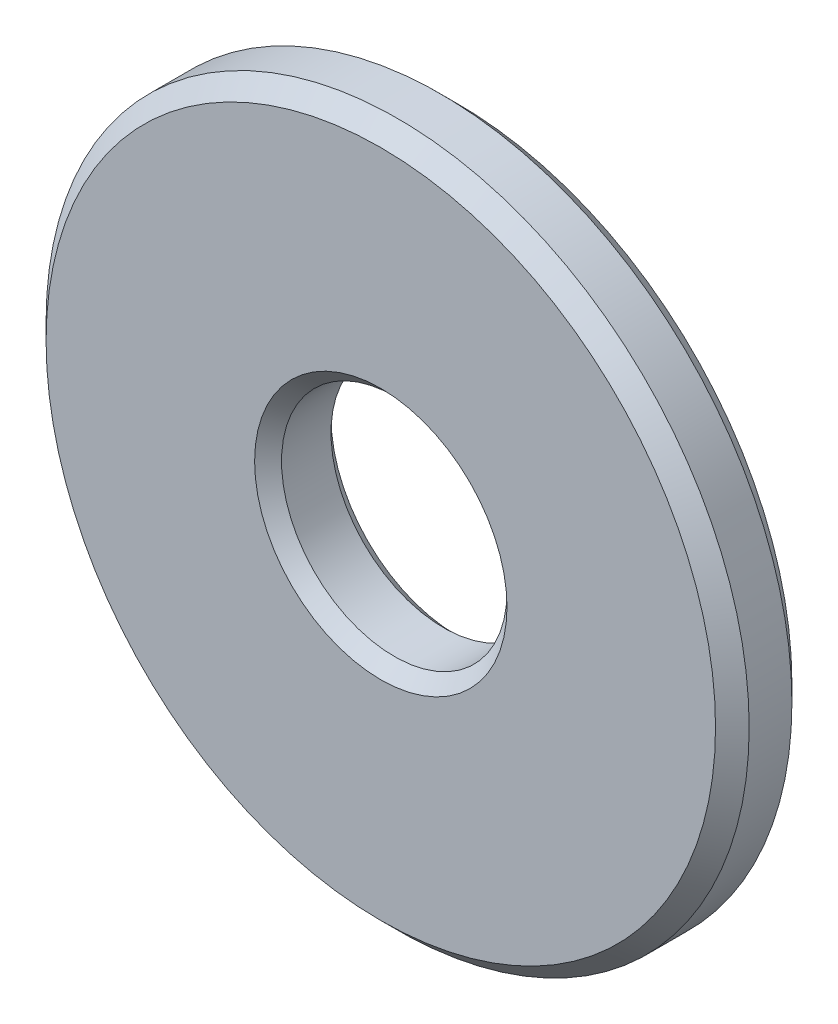
ISO-10303-21;
HEADER;
FILE_DESCRIPTION(('STEP AP214'),'2;1');
FILE_NAME('part.step','',(''),(''),'','','');
FILE_SCHEMA(('AUTOMOTIVE_DESIGN { 1 0 10303 214 1 1 1 1 }'));
ENDSEC;
DATA;
#1=APPLICATION_CONTEXT('core data for automotive mechanical design processes');
#2=APPLICATION_PROTOCOL_DEFINITION('international standard','automotive_design',2000,#1);
#3=PRODUCT_CONTEXT('',#1,'mechanical');
#4=PRODUCT('Part','Part','',(#3));
#5=PRODUCT_RELATED_PRODUCT_CATEGORY('part','',(#4));
#6=PRODUCT_DEFINITION_FORMATION('','',#4);
#7=PRODUCT_DEFINITION_CONTEXT('part definition',#1,'design');
#8=PRODUCT_DEFINITION('design','',#6,#7);
#9=PRODUCT_DEFINITION_SHAPE('','',#8);
#10=(LENGTH_UNIT() NAMED_UNIT(*) SI_UNIT(.MILLI.,.METRE.));
#11=(NAMED_UNIT(*) PLANE_ANGLE_UNIT() SI_UNIT($,.RADIAN.));
#12=(NAMED_UNIT(*) SI_UNIT($,.STERADIAN.) SOLID_ANGLE_UNIT());
#13=UNCERTAINTY_MEASURE_WITH_UNIT(LENGTH_MEASURE(1.E-05),#10,'distance_accuracy_value','');
#14=(GEOMETRIC_REPRESENTATION_CONTEXT(3) GLOBAL_UNCERTAINTY_ASSIGNED_CONTEXT((#13)) GLOBAL_UNIT_ASSIGNED_CONTEXT((#10,
#11,#12)) REPRESENTATION_CONTEXT('',''));
#15=CARTESIAN_POINT('',(0.,0.,0.));
#16=DIRECTION('',(0.,0.,1.));
#17=DIRECTION('',(1.,0.,0.));
#18=AXIS2_PLACEMENT_3D('',#15,#16,#17);
#19=CARTESIAN_POINT('',(0.,0.,5.7658));
#20=DIRECTION('',(0.,0.,-1.));
#21=DIRECTION('',(-1.,0.,0.));
#22=AXIS2_PLACEMENT_3D('',#19,#20,#21);
#23=CYLINDRICAL_SURFACE('',#22,26.5339923218);
#24=CARTESIAN_POINT('',(0.,0.,1.27000000000004));
#25=DIRECTION('',(0.,0.,1.));
#26=DIRECTION('',(1.,0.,0.));
#27=AXIS2_PLACEMENT_3D('',#24,#25,#26);
#28=CIRCLE('',#27,26.5339923218);
#29=CARTESIAN_POINT('',(-26.5339923218,0.,1.27000000000003));
#30=VERTEX_POINT('',#29);
#31=EDGE_CURVE('E66',#30,#30,#28,.T.);
#32=CARTESIAN_POINT('',(0.,0.,4.49580000000004));
#33=DIRECTION('',(0.,0.,1.));
#34=DIRECTION('',(1.,0.,0.));
#35=AXIS2_PLACEMENT_3D('',#32,#33,#34);
#36=CIRCLE('',#35,26.5339923218);
#37=CARTESIAN_POINT('',(-26.5339923218,0.,4.49580000000004));
#38=VERTEX_POINT('',#37);
#39=EDGE_CURVE('E69',#38,#38,#36,.F.);
#40=CARTESIAN_POINT('',(-26.5339923218,0.,1.27000000000003));
#41=CARTESIAN_POINT('',(-26.5339923218,0.,1.30360208333337));
#42=CARTESIAN_POINT('',(-26.5339923218,0.,1.3372041666667));
#43=CARTESIAN_POINT('',(-26.5339923218,0.,1.40440833333337));
#44=CARTESIAN_POINT('',(-26.5339923218,0.,1.4380104166667));
#45=CARTESIAN_POINT('',(-26.5339923218,0.,1.50521458333337));
#46=CARTESIAN_POINT('',(-26.5339923218,0.,1.5388166666667));
#47=CARTESIAN_POINT('',(-26.5339923218,0.,1.60602083333337));
#48=CARTESIAN_POINT('',(-26.5339923218,0.,1.6396229166667));
#49=CARTESIAN_POINT('',(-26.5339923218,0.,1.70682708333337));
#50=CARTESIAN_POINT('',(-26.5339923218,0.,1.7404291666667));
#51=CARTESIAN_POINT('',(-26.5339923218,0.,1.80763333333337));
#52=CARTESIAN_POINT('',(-26.5339923218,0.,1.8412354166667));
#53=CARTESIAN_POINT('',(-26.5339923218,0.,1.90843958333337));
#54=CARTESIAN_POINT('',(-26.5339923218,0.,1.9420416666667));
#55=CARTESIAN_POINT('',(-26.5339923218,0.,2.00924583333337));
#56=CARTESIAN_POINT('',(-26.5339923218,0.,2.0428479166667));
#57=CARTESIAN_POINT('',(-26.5339923218,0.,2.11005208333337));
#58=CARTESIAN_POINT('',(-26.5339923218,0.,2.1436541666667));
#59=CARTESIAN_POINT('',(-26.5339923218,0.,2.21085833333337));
#60=CARTESIAN_POINT('',(-26.5339923218,0.,2.2444604166667));
#61=CARTESIAN_POINT('',(-26.5339923218,0.,2.31166458333337));
#62=CARTESIAN_POINT('',(-26.5339923218,0.,2.3452666666667));
#63=CARTESIAN_POINT('',(-26.5339923218,0.,2.41247083333337));
#64=CARTESIAN_POINT('',(-26.5339923218,0.,2.4460729166667));
#65=CARTESIAN_POINT('',(-26.5339923218,0.,2.51327708333337));
#66=CARTESIAN_POINT('',(-26.5339923218,0.,2.5468791666667));
#67=CARTESIAN_POINT('',(-26.5339923218,0.,2.61408333333337));
#68=CARTESIAN_POINT('',(-26.5339923218,0.,2.6476854166667));
#69=CARTESIAN_POINT('',(-26.5339923218,0.,2.71488958333337));
#70=CARTESIAN_POINT('',(-26.5339923218,0.,2.7484916666667));
#71=CARTESIAN_POINT('',(-26.5339923218,0.,2.81569583333337));
#72=CARTESIAN_POINT('',(-26.5339923218,0.,2.84929791666671));
#73=CARTESIAN_POINT('',(-26.5339923218,0.,2.91650208333337));
#74=CARTESIAN_POINT('',(-26.5339923218,0.,2.95010416666671));
#75=CARTESIAN_POINT('',(-26.5339923218,0.,3.01730833333337));
#76=CARTESIAN_POINT('',(-26.5339923218,0.,3.05091041666671));
#77=CARTESIAN_POINT('',(-26.5339923218,0.,3.11811458333337));
#78=CARTESIAN_POINT('',(-26.5339923218,0.,3.15171666666671));
#79=CARTESIAN_POINT('',(-26.5339923218,0.,3.21892083333337));
#80=CARTESIAN_POINT('',(-26.5339923218,0.,3.25252291666671));
#81=CARTESIAN_POINT('',(-26.5339923218,0.,3.31972708333337));
#82=CARTESIAN_POINT('',(-26.5339923218,0.,3.35332916666671));
#83=CARTESIAN_POINT('',(-26.5339923218,0.,3.42053333333337));
#84=CARTESIAN_POINT('',(-26.5339923218,0.,3.45413541666671));
#85=CARTESIAN_POINT('',(-26.5339923218,0.,3.52133958333337));
#86=CARTESIAN_POINT('',(-26.5339923218,0.,3.55494166666671));
#87=CARTESIAN_POINT('',(-26.5339923218,0.,3.62214583333337));
#88=CARTESIAN_POINT('',(-26.5339923218,0.,3.65574791666671));
#89=CARTESIAN_POINT('',(-26.5339923218,0.,3.72295208333337));
#90=CARTESIAN_POINT('',(-26.5339923218,0.,3.75655416666671));
#91=CARTESIAN_POINT('',(-26.5339923218,0.,3.82375833333338));
#92=CARTESIAN_POINT('',(-26.5339923218,0.,3.85736041666671));
#93=CARTESIAN_POINT('',(-26.5339923218,0.,3.92456458333338));
#94=CARTESIAN_POINT('',(-26.5339923218,0.,3.95816666666671));
#95=CARTESIAN_POINT('',(-26.5339923218,0.,4.02537083333338));
#96=CARTESIAN_POINT('',(-26.5339923218,0.,4.05897291666671));
#97=CARTESIAN_POINT('',(-26.5339923218,0.,4.12617708333338));
#98=CARTESIAN_POINT('',(-26.5339923218,0.,4.15977916666671));
#99=CARTESIAN_POINT('',(-26.5339923218,0.,4.22698333333338));
#100=CARTESIAN_POINT('',(-26.5339923218,0.,4.26058541666671));
#101=CARTESIAN_POINT('',(-26.5339923218,0.,4.32778958333338));
#102=CARTESIAN_POINT('',(-26.5339923218,0.,4.36139166666671));
#103=CARTESIAN_POINT('',(-26.5339923218,0.,4.42859583333338));
#104=CARTESIAN_POINT('',(-26.5339923218,0.,4.46219791666671));
#105=CARTESIAN_POINT('',(-26.5339923218,0.,4.49580000000004));
#106=B_SPLINE_CURVE_WITH_KNOTS('',3,(#40,#41,#42,#43,#44,#45,#46,#47,#48,#49,#50,#51,#52,#53,
#54,#55,#56,#57,#58,#59,#60,#61,#62,#63,#64,#65,#66,#67,#68,#69,#70,#71,#72,#73,#74,#75,#76,#77,
#78,#79,#80,#81,#82,#83,#84,#85,#86,#87,#88,#89,#90,#91,#92,#93,#94,#95,#96,#97,#98,#99,#100,
#101,#102,#103,#104,#105),.UNSPECIFIED.,.F.,.F.,(4,2,2,2,2,2,2,2,2,2,2,2,2,2,2,2,2,2,2,2,2,2,2,
2,2,2,2,2,2,2,2,2,4),(0.,0.10080625,0.201612500000001,0.302418750000001,0.403225000000001,
0.504031250000002,0.604837500000001,0.705643750000002,0.806450000000002,0.907256250000002,
1.0080625,1.10886875,1.209675,1.31048125,1.4112875,1.51209375,1.6129,1.71370625000001,
1.81451250000001,1.91531875000001,2.01612500000001,2.11693125000001,2.21773750000001,
2.31854375000001,2.41935000000001,2.52015625000001,2.62096250000001,2.72176875000001,
2.82257500000001,2.92338125000001,3.02418750000001,3.12499375000001,3.22580000000001),.UNSPECIFIED.);
#107=EDGE_CURVE('BSEAM39',#30,#38,#106,.T.);
#108=ORIENTED_EDGE('',*,*,#31,.T.);
#109=ORIENTED_EDGE('',*,*,#39,.T.);
#110=ORIENTED_EDGE('',*,*,#107,.T.);
#111=ORIENTED_EDGE('',*,*,#107,.F.);
#112=EDGE_LOOP('',(#108,#110,#109,#111));
#113=FACE_BOUND('',#112,.T.);
#114=ADVANCED_FACE('F39',(#113),#23,.T.);
#115=CARTESIAN_POINT('',(0.,0.,5.7658));
#116=DIRECTION('',(0.,0.,1.));
#117=DIRECTION('',(1.,0.,0.));
#118=AXIS2_PLACEMENT_3D('',#115,#116,#117);
#119=PLANE('',#118);
#120=CARTESIAN_POINT('',(0.,0.,5.7658));
#121=DIRECTION('',(0.,0.,1.));
#122=DIRECTION('',(1.,0.,0.));
#123=AXIS2_PLACEMENT_3D('',#120,#121,#122);
#124=CIRCLE('',#123,9.52500000000007);
#125=CARTESIAN_POINT('',(9.52500000000007,0.,5.7658));
#126=VERTEX_POINT('',#125);
#127=EDGE_CURVE('E10',#126,#126,#124,.F.);
#128=ORIENTED_EDGE('',*,*,#127,.T.);
#129=EDGE_LOOP('',(#128));
#130=FACE_BOUND('',#129,.T.);
#131=CARTESIAN_POINT('',(0.,0.,5.7658));
#132=DIRECTION('',(0.,0.,1.));
#133=DIRECTION('',(1.,0.,0.));
#134=AXIS2_PLACEMENT_3D('',#131,#132,#133);
#135=CIRCLE('',#134,25.2639923218);
#136=CARTESIAN_POINT('',(25.2639923218,0.,5.7658));
#137=VERTEX_POINT('',#136);
#138=EDGE_CURVE('E60',#137,#137,#135,.T.);
#139=ORIENTED_EDGE('',*,*,#138,.T.);
#140=EDGE_LOOP('',(#139));
#141=FACE_BOUND('',#140,.T.);
#142=ADVANCED_FACE('F82',(#130,#141),#119,.T.);
#143=CARTESIAN_POINT('',(0.,0.,0.));
#144=DIRECTION('',(0.,0.,1.));
#145=DIRECTION('',(1.,0.,0.));
#146=AXIS2_PLACEMENT_3D('',#143,#144,#145);
#147=PLANE('',#146);
#148=CARTESIAN_POINT('',(0.,0.,0.));
#149=DIRECTION('',(0.,0.,1.));
#150=DIRECTION('',(1.,0.,0.));
#151=AXIS2_PLACEMENT_3D('',#148,#149,#150);
#152=CIRCLE('',#151,9.52499999999999);
#153=CARTESIAN_POINT('',(9.52499999999999,0.,0.));
#154=VERTEX_POINT('',#153);
#155=EDGE_CURVE('E55',#154,#154,#152,.T.);
#156=ORIENTED_EDGE('',*,*,#155,.T.);
#157=EDGE_LOOP('',(#156));
#158=FACE_BOUND('',#157,.T.);
#159=CARTESIAN_POINT('',(0.,0.,0.));
#160=DIRECTION('',(0.,0.,1.));
#161=DIRECTION('',(1.,0.,0.));
#162=AXIS2_PLACEMENT_3D('',#159,#160,#161);
#163=CIRCLE('',#162,25.2639923218);
#164=CARTESIAN_POINT('',(25.2639923218,0.,0.));
#165=VERTEX_POINT('',#164);
#166=EDGE_CURVE('E63',#165,#165,#163,.F.);
#167=ORIENTED_EDGE('',*,*,#166,.T.);
#168=EDGE_LOOP('',(#167));
#169=FACE_BOUND('',#168,.T.);
#170=ADVANCED_FACE('F84',(#158,#169),#147,.F.);
#171=CARTESIAN_POINT('',(0.,0.,1.27000000000004));
#172=DIRECTION('',(0.,0.,1.));
#173=DIRECTION('',(1.,0.,0.));
#174=AXIS2_PLACEMENT_3D('',#171,#172,#173);
#175=CONICAL_SURFACE('',#174,26.5339923218,0.785398163397452);
#176=ORIENTED_EDGE('',*,*,#166,.F.);
#177=EDGE_LOOP('',(#176));
#178=FACE_BOUND('',#177,.T.);
#179=ORIENTED_EDGE('',*,*,#31,.F.);
#180=EDGE_LOOP('',(#179));
#181=FACE_BOUND('',#180,.T.);
#182=ADVANCED_FACE('F78',(#178,#181),#175,.T.);
#183=CARTESIAN_POINT('',(0.,0.,5.7658));
#184=DIRECTION('',(0.,0.,-1.));
#185=DIRECTION('',(-1.,0.,0.));
#186=AXIS2_PLACEMENT_3D('',#183,#184,#185);
#187=CONICAL_SURFACE('',#186,25.2639923218,0.78539816339745);
#188=ORIENTED_EDGE('',*,*,#39,.F.);
#189=EDGE_LOOP('',(#188));
#190=FACE_BOUND('',#189,.T.);
#191=ORIENTED_EDGE('',*,*,#138,.F.);
#192=EDGE_LOOP('',(#191));
#193=FACE_BOUND('',#192,.T.);
#194=ADVANCED_FACE('F74',(#190,#193),#187,.T.);
#195=CARTESIAN_POINT('',(0.,0.,0.));
#196=DIRECTION('',(0.,0.,1.));
#197=DIRECTION('',(1.,0.,0.));
#198=AXIS2_PLACEMENT_3D('',#195,#196,#197);
#199=CYLINDRICAL_SURFACE('',#198,8.509);
#200=CARTESIAN_POINT('',(0.,0.,1.01599999999999));
#201=DIRECTION('',(0.,0.,1.));
#202=DIRECTION('',(1.,0.,0.));
#203=AXIS2_PLACEMENT_3D('',#200,#201,#202);
#204=CIRCLE('',#203,8.509);
#205=CARTESIAN_POINT('',(8.509,0.,1.01599999999999));
#206=VERTEX_POINT('',#205);
#207=EDGE_CURVE('E47',#206,#206,#204,.F.);
#208=CARTESIAN_POINT('',(0.,0.,4.74979999999995));
#209=DIRECTION('',(0.,0.,1.));
#210=DIRECTION('',(1.,0.,0.));
#211=AXIS2_PLACEMENT_3D('',#208,#209,#210);
#212=CIRCLE('',#211,8.509);
#213=CARTESIAN_POINT('',(8.509,0.,4.74979999999995));
#214=VERTEX_POINT('',#213);
#215=EDGE_CURVE('E51',#214,#214,#212,.T.);
#216=CARTESIAN_POINT('',(8.509,0.,1.01599999999999));
#217=CARTESIAN_POINT('',(8.509,0.,1.05489374999999));
#218=CARTESIAN_POINT('',(8.509,0.,1.09378749999999));
#219=CARTESIAN_POINT('',(8.509,0.,1.17157499999999));
#220=CARTESIAN_POINT('',(8.509,0.,1.21046874999999));
#221=CARTESIAN_POINT('',(8.509,0.,1.28825624999998));
#222=CARTESIAN_POINT('',(8.509,0.,1.32714999999998));
#223=CARTESIAN_POINT('',(8.509,0.,1.40493749999998));
#224=CARTESIAN_POINT('',(8.509,0.,1.44383124999998));
#225=CARTESIAN_POINT('',(8.509,0.,1.52161874999998));
#226=CARTESIAN_POINT('',(8.509,0.,1.56051249999998));
#227=CARTESIAN_POINT('',(8.509,0.,1.63829999999998));
#228=CARTESIAN_POINT('',(8.509,0.,1.67719374999998));
#229=CARTESIAN_POINT('',(8.509,0.,1.75498124999998));
#230=CARTESIAN_POINT('',(8.509,0.,1.79387499999998));
#231=CARTESIAN_POINT('',(8.509,0.,1.87166249999998));
#232=CARTESIAN_POINT('',(8.509,0.,1.91055624999998));
#233=CARTESIAN_POINT('',(8.509,0.,1.98834374999998));
#234=CARTESIAN_POINT('',(8.509,0.,2.02723749999998));
#235=CARTESIAN_POINT('',(8.509,0.,2.10502499999998));
#236=CARTESIAN_POINT('',(8.509,0.,2.14391874999997));
#237=CARTESIAN_POINT('',(8.509,0.,2.22170624999997));
#238=CARTESIAN_POINT('',(8.509,0.,2.26059999999997));
#239=CARTESIAN_POINT('',(8.509,0.,2.33838749999997));
#240=CARTESIAN_POINT('',(8.509,0.,2.37728124999997));
#241=CARTESIAN_POINT('',(8.509,0.,2.45506874999997));
#242=CARTESIAN_POINT('',(8.509,0.,2.49396249999997));
#243=CARTESIAN_POINT('',(8.509,0.,2.57174999999997));
#244=CARTESIAN_POINT('',(8.509,0.,2.61064374999997));
#245=CARTESIAN_POINT('',(8.509,0.,2.68843124999997));
#246=CARTESIAN_POINT('',(8.509,0.,2.72732499999997));
#247=CARTESIAN_POINT('',(8.509,0.,2.80511249999997));
#248=CARTESIAN_POINT('',(8.509,0.,2.84400624999997));
#249=CARTESIAN_POINT('',(8.509,0.,2.92179374999997));
#250=CARTESIAN_POINT('',(8.509,0.,2.96068749999997));
#251=CARTESIAN_POINT('',(8.509,0.,3.03847499999996));
#252=CARTESIAN_POINT('',(8.509,0.,3.07736874999996));
#253=CARTESIAN_POINT('',(8.509,0.,3.15515624999996));
#254=CARTESIAN_POINT('',(8.509,0.,3.19404999999996));
#255=CARTESIAN_POINT('',(8.509,0.,3.27183749999996));
#256=CARTESIAN_POINT('',(8.509,0.,3.31073124999996));
#257=CARTESIAN_POINT('',(8.509,0.,3.38851874999996));
#258=CARTESIAN_POINT('',(8.509,0.,3.42741249999996));
#259=CARTESIAN_POINT('',(8.509,0.,3.50519999999996));
#260=CARTESIAN_POINT('',(8.509,0.,3.54409374999996));
#261=CARTESIAN_POINT('',(8.509,0.,3.62188124999996));
#262=CARTESIAN_POINT('',(8.509,0.,3.66077499999996));
#263=CARTESIAN_POINT('',(8.509,0.,3.73856249999996));
#264=CARTESIAN_POINT('',(8.509,0.,3.77745624999996));
#265=CARTESIAN_POINT('',(8.509,0.,3.85524374999996));
#266=CARTESIAN_POINT('',(8.509,0.,3.89413749999995));
#267=CARTESIAN_POINT('',(8.509,0.,3.97192499999995));
#268=CARTESIAN_POINT('',(8.509,0.,4.01081874999995));
#269=CARTESIAN_POINT('',(8.509,0.,4.08860624999995));
#270=CARTESIAN_POINT('',(8.509,0.,4.12749999999995));
#271=CARTESIAN_POINT('',(8.509,0.,4.20528749999995));
#272=CARTESIAN_POINT('',(8.509,0.,4.24418124999995));
#273=CARTESIAN_POINT('',(8.509,0.,4.32196874999995));
#274=CARTESIAN_POINT('',(8.509,0.,4.36086249999995));
#275=CARTESIAN_POINT('',(8.509,0.,4.43864999999995));
#276=CARTESIAN_POINT('',(8.509,0.,4.47754374999995));
#277=CARTESIAN_POINT('',(8.509,0.,4.55533124999995));
#278=CARTESIAN_POINT('',(8.509,0.,4.59422499999995));
#279=CARTESIAN_POINT('',(8.509,0.,4.67201249999995));
#280=CARTESIAN_POINT('',(8.509,0.,4.71090624999995));
#281=CARTESIAN_POINT('',(8.509,0.,4.74979999999995));
#282=B_SPLINE_CURVE_WITH_KNOTS('',3,(#216,#217,#218,#219,#220,#221,#222,#223,#224,#225,#226,
#227,#228,#229,#230,#231,#232,#233,#234,#235,#236,#237,#238,#239,#240,#241,#242,#243,#244,#245,
#246,#247,#248,#249,#250,#251,#252,#253,#254,#255,#256,#257,#258,#259,#260,#261,#262,#263,#264,
#265,#266,#267,#268,#269,#270,#271,#272,#273,#274,#275,#276,#277,#278,#279,#280,#281),
.UNSPECIFIED.,.F.,.F.,(4,2,2,2,2,2,2,2,2,2,2,2,2,2,2,2,2,2,2,2,2,2,2,2,2,2,2,2,2,2,2,2,4),(0.,
0.116681249999999,0.233362499999998,0.350043749999996,0.466724999999995,0.583406249999994,
0.700087499999992,0.816768749999991,0.93344999999999,1.05013124999999,1.16681249999999,
1.28349374999999,1.40017499999998,1.51685624999998,1.63353749999998,1.75021874999998,
1.86689999999998,1.98358124999998,2.10026249999998,2.21694374999998,2.33362499999997,
2.45030624999997,2.56698749999997,2.68366874999997,2.80034999999997,2.91703124999997,
3.03371249999997,3.15039374999997,3.26707499999996,3.38375624999996,3.50043749999996,
3.61711874999996,3.73379999999996),.UNSPECIFIED.);
#283=EDGE_CURVE('BSEAM77',#206,#214,#282,.T.);
#284=ORIENTED_EDGE('',*,*,#207,.T.);
#285=ORIENTED_EDGE('',*,*,#215,.T.);
#286=ORIENTED_EDGE('',*,*,#283,.T.);
#287=ORIENTED_EDGE('',*,*,#283,.F.);
#288=EDGE_LOOP('',(#284,#286,#285,#287));
#289=FACE_BOUND('',#288,.T.);
#290=ADVANCED_FACE('F77',(#289),#199,.F.);
#291=CARTESIAN_POINT('',(0.,0.,0.));
#292=DIRECTION('',(0.,0.,-1.));
#293=DIRECTION('',(-1.,0.,0.));
#294=AXIS2_PLACEMENT_3D('',#291,#292,#293);
#295=CONICAL_SURFACE('',#294,9.52499999999999,0.785398163397449);
#296=ORIENTED_EDGE('',*,*,#207,.F.);
#297=EDGE_LOOP('',(#296));
#298=FACE_BOUND('',#297,.T.);
#299=ORIENTED_EDGE('',*,*,#155,.F.);
#300=EDGE_LOOP('',(#299));
#301=FACE_BOUND('',#300,.T.);
#302=ADVANCED_FACE('F105',(#298,#301),#295,.F.);
#303=CARTESIAN_POINT('',(0.,0.,4.74979999999995));
#304=DIRECTION('',(0.,0.,1.));
#305=DIRECTION('',(1.,0.,0.));
#306=AXIS2_PLACEMENT_3D('',#303,#304,#305);
#307=CONICAL_SURFACE('',#306,8.509,0.785398163397454);
#308=ORIENTED_EDGE('',*,*,#127,.F.);
#309=EDGE_LOOP('',(#308));
#310=FACE_BOUND('',#309,.T.);
#311=ORIENTED_EDGE('',*,*,#215,.F.);
#312=EDGE_LOOP('',(#311));
#313=FACE_BOUND('',#312,.T.);
#314=ADVANCED_FACE('F42',(#310,#313),#307,.F.);
#315=CLOSED_SHELL('',(#114,#142,#170,#182,#194,#290,#302,#314));
#316=MANIFOLD_SOLID_BREP('B2',#315);
#317=ADVANCED_BREP_SHAPE_REPRESENTATION('',(#18,#316),#14);
#318=SHAPE_DEFINITION_REPRESENTATION(#9,#317);
ENDSEC;
END-ISO-10303-21;
